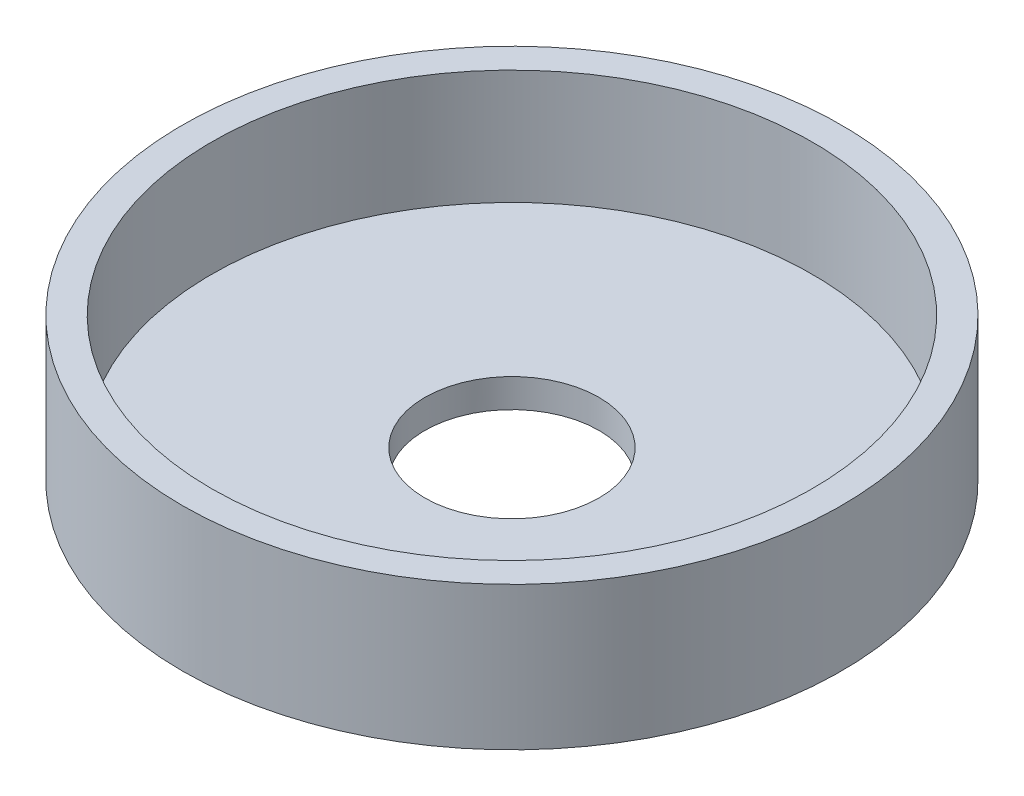
ISO-10303-21;
HEADER;
FILE_DESCRIPTION(('STEP AP214'),'2;1');
FILE_NAME('part.step','',(''),(''),'','','');
FILE_SCHEMA(('AUTOMOTIVE_DESIGN { 1 0 10303 214 1 1 1 1 }'));
ENDSEC;
DATA;
#1=APPLICATION_CONTEXT('core data for automotive mechanical design processes');
#2=APPLICATION_PROTOCOL_DEFINITION('international standard','automotive_design',2000,#1);
#3=PRODUCT_CONTEXT('',#1,'mechanical');
#4=PRODUCT('Part','Part','',(#3));
#5=PRODUCT_RELATED_PRODUCT_CATEGORY('part','',(#4));
#6=PRODUCT_DEFINITION_FORMATION('','',#4);
#7=PRODUCT_DEFINITION_CONTEXT('part definition',#1,'design');
#8=PRODUCT_DEFINITION('design','',#6,#7);
#9=PRODUCT_DEFINITION_SHAPE('','',#8);
#10=(LENGTH_UNIT() NAMED_UNIT(*) SI_UNIT(.MILLI.,.METRE.));
#11=(NAMED_UNIT(*) PLANE_ANGLE_UNIT() SI_UNIT($,.RADIAN.));
#12=(NAMED_UNIT(*) SI_UNIT($,.STERADIAN.) SOLID_ANGLE_UNIT());
#13=UNCERTAINTY_MEASURE_WITH_UNIT(LENGTH_MEASURE(1.E-05),#10,'distance_accuracy_value','');
#14=(GEOMETRIC_REPRESENTATION_CONTEXT(3) GLOBAL_UNCERTAINTY_ASSIGNED_CONTEXT((#13)) GLOBAL_UNIT_ASSIGNED_CONTEXT((#10,
#11,#12)) REPRESENTATION_CONTEXT('',''));
#15=CARTESIAN_POINT('',(0.,0.,0.));
#16=DIRECTION('',(0.,0.,1.));
#17=DIRECTION('',(1.,0.,0.));
#18=AXIS2_PLACEMENT_3D('',#15,#16,#17);
#19=CARTESIAN_POINT('',(0.,6.35,0.));
#20=DIRECTION('',(0.,-1.,0.));
#21=DIRECTION('',(0.,0.,-1.));
#22=AXIS2_PLACEMENT_3D('',#19,#20,#21);
#23=CYLINDRICAL_SURFACE('',#22,73.025);
#24=CARTESIAN_POINT('',(0.,0.,0.));
#25=DIRECTION('',(0.,1.,0.));
#26=DIRECTION('',(0.,0.,1.));
#27=AXIS2_PLACEMENT_3D('',#24,#25,#26);
#28=CIRCLE('',#27,73.025);
#29=CARTESIAN_POINT('',(0.,0.,73.025));
#30=VERTEX_POINT('',#29);
#31=EDGE_CURVE('E48',#30,#30,#28,.T.);
#32=ORIENTED_EDGE('',*,*,#31,.T.);
#33=EDGE_LOOP('',(#32));
#34=FACE_BOUND('',#33,.T.);
#35=CARTESIAN_POINT('',(0.,31.75,0.));
#36=DIRECTION('',(0.,1.,0.));
#37=DIRECTION('',(0.,0.,1.));
#38=AXIS2_PLACEMENT_3D('',#35,#36,#37);
#39=CIRCLE('',#38,73.025);
#40=CARTESIAN_POINT('',(0.,31.75,73.025));
#41=VERTEX_POINT('',#40);
#42=EDGE_CURVE('E53',#41,#41,#39,.T.);
#43=ORIENTED_EDGE('',*,*,#42,.F.);
#44=EDGE_LOOP('',(#43));
#45=FACE_BOUND('',#44,.T.);
#46=ADVANCED_FACE('F41',(#34,#45),#23,.T.);
#47=CARTESIAN_POINT('',(0.,0.,0.));
#48=DIRECTION('',(0.,1.,0.));
#49=DIRECTION('',(0.,0.,1.));
#50=AXIS2_PLACEMENT_3D('',#47,#48,#49);
#51=PLANE('',#50);
#52=CARTESIAN_POINT('',(0.,0.,0.));
#53=DIRECTION('',(0.,-1.,0.));
#54=DIRECTION('',(0.,0.,-1.));
#55=AXIS2_PLACEMENT_3D('',#52,#53,#54);
#56=CIRCLE('',#55,19.304);
#57=CARTESIAN_POINT('',(0.,0.,-19.304));
#58=VERTEX_POINT('',#57);
#59=EDGE_CURVE('E64',#58,#58,#56,.T.);
#60=ORIENTED_EDGE('',*,*,#59,.F.);
#61=EDGE_LOOP('',(#60));
#62=FACE_BOUND('',#61,.T.);
#63=ORIENTED_EDGE('',*,*,#31,.F.);
#64=EDGE_LOOP('',(#63));
#65=FACE_BOUND('',#64,.T.);
#66=ADVANCED_FACE('F75',(#62,#65),#51,.F.);
#67=CARTESIAN_POINT('',(0.,31.75,0.));
#68=DIRECTION('',(0.,1.,0.));
#69=DIRECTION('',(0.,0.,1.));
#70=AXIS2_PLACEMENT_3D('',#67,#68,#69);
#71=PLANE('',#70);
#72=ORIENTED_EDGE('',*,*,#42,.T.);
#73=EDGE_LOOP('',(#72));
#74=FACE_BOUND('',#73,.T.);
#75=CARTESIAN_POINT('',(0.,31.75,0.));
#76=DIRECTION('',(0.,1.,0.));
#77=DIRECTION('',(0.,0.,1.));
#78=AXIS2_PLACEMENT_3D('',#75,#76,#77);
#79=CIRCLE('',#78,66.548);
#80=CARTESIAN_POINT('',(0.,31.75,66.548));
#81=VERTEX_POINT('',#80);
#82=EDGE_CURVE('E58',#81,#81,#79,.T.);
#83=ORIENTED_EDGE('',*,*,#82,.F.);
#84=EDGE_LOOP('',(#83));
#85=FACE_BOUND('',#84,.T.);
#86=ADVANCED_FACE('F78',(#74,#85),#71,.T.);
#87=CARTESIAN_POINT('',(0.,31.75,0.));
#88=DIRECTION('',(0.,-1.,0.));
#89=DIRECTION('',(0.,0.,-1.));
#90=AXIS2_PLACEMENT_3D('',#87,#88,#89);
#91=CYLINDRICAL_SURFACE('',#90,66.548);
#92=ORIENTED_EDGE('',*,*,#82,.T.);
#93=EDGE_LOOP('',(#92));
#94=FACE_BOUND('',#93,.T.);
#95=CARTESIAN_POINT('',(0.,6.35,0.));
#96=DIRECTION('',(0.,1.,0.));
#97=DIRECTION('',(0.,0.,1.));
#98=AXIS2_PLACEMENT_3D('',#95,#96,#97);
#99=CIRCLE('',#98,66.548);
#100=CARTESIAN_POINT('',(0.,6.35,66.548));
#101=VERTEX_POINT('',#100);
#102=EDGE_CURVE('E10',#101,#101,#99,.F.);
#103=ORIENTED_EDGE('',*,*,#102,.T.);
#104=EDGE_LOOP('',(#103));
#105=FACE_BOUND('',#104,.T.);
#106=ADVANCED_FACE('F83',(#94,#105),#91,.F.);
#107=CARTESIAN_POINT('',(0.,6.35,0.));
#108=DIRECTION('',(0.,1.,0.));
#109=DIRECTION('',(0.,0.,1.));
#110=AXIS2_PLACEMENT_3D('',#107,#108,#109);
#111=PLANE('',#110);
#112=CARTESIAN_POINT('',(0.,6.35,0.));
#113=DIRECTION('',(0.,1.,0.));
#114=DIRECTION('',(0.,0.,1.));
#115=AXIS2_PLACEMENT_3D('',#112,#113,#114);
#116=CIRCLE('',#115,19.304);
#117=CARTESIAN_POINT('',(0.,6.35,19.304));
#118=VERTEX_POINT('',#117);
#119=EDGE_CURVE('E65',#118,#118,#116,.F.);
#120=ORIENTED_EDGE('',*,*,#119,.T.);
#121=EDGE_LOOP('',(#120));
#122=FACE_BOUND('',#121,.T.);
#123=ORIENTED_EDGE('',*,*,#102,.F.);
#124=EDGE_LOOP('',(#123));
#125=FACE_BOUND('',#124,.T.);
#126=ADVANCED_FACE('F87',(#122,#125),#111,.T.);
#127=CARTESIAN_POINT('',(0.,31.751,0.));
#128=DIRECTION('',(0.,-1.,0.));
#129=DIRECTION('',(0.,0.,-1.));
#130=AXIS2_PLACEMENT_3D('',#127,#128,#129);
#131=CYLINDRICAL_SURFACE('',#130,19.304);
#132=ORIENTED_EDGE('',*,*,#119,.F.);
#133=EDGE_LOOP('',(#132));
#134=FACE_BOUND('',#133,.T.);
#135=ORIENTED_EDGE('',*,*,#59,.T.);
#136=EDGE_LOOP('',(#135));
#137=FACE_BOUND('',#136,.T.);
#138=ADVANCED_FACE('F73',(#134,#137),#131,.F.);
#139=CLOSED_SHELL('',(#46,#66,#86,#106,#126,#138));
#140=MANIFOLD_SOLID_BREP('B2',#139);
#141=ADVANCED_BREP_SHAPE_REPRESENTATION('',(#18,#140),#14);
#142=SHAPE_DEFINITION_REPRESENTATION(#9,#141);
ENDSEC;
END-ISO-10303-21;
